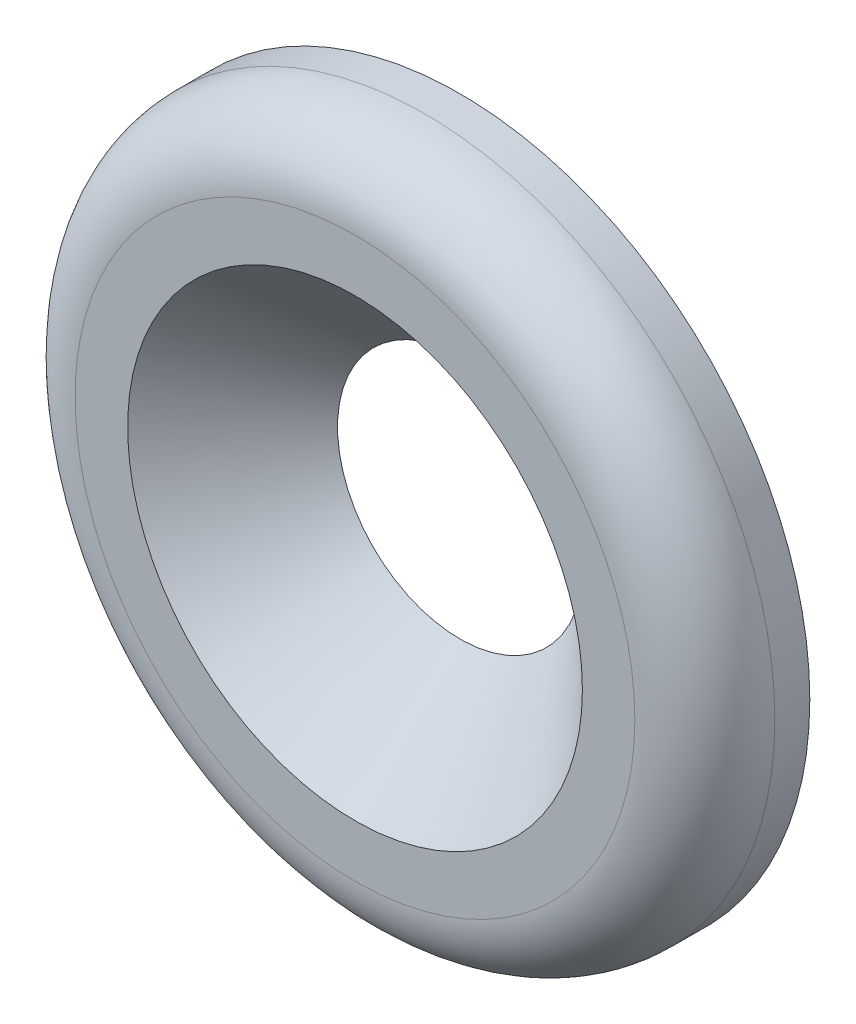
ISO-10303-21;
HEADER;
FILE_DESCRIPTION(('STEP AP214'),'2;1');
FILE_NAME('part.step','',(''),(''),'','','');
FILE_SCHEMA(('AUTOMOTIVE_DESIGN { 1 0 10303 214 1 1 1 1 }'));
ENDSEC;
DATA;
#1=APPLICATION_CONTEXT('core data for automotive mechanical design processes');
#2=APPLICATION_PROTOCOL_DEFINITION('international standard','automotive_design',2000,#1);
#3=PRODUCT_CONTEXT('',#1,'mechanical');
#4=PRODUCT('Part','Part','',(#3));
#5=PRODUCT_RELATED_PRODUCT_CATEGORY('part','',(#4));
#6=PRODUCT_DEFINITION_FORMATION('','',#4);
#7=PRODUCT_DEFINITION_CONTEXT('part definition',#1,'design');
#8=PRODUCT_DEFINITION('design','',#6,#7);
#9=PRODUCT_DEFINITION_SHAPE('','',#8);
#10=(LENGTH_UNIT() NAMED_UNIT(*) SI_UNIT(.MILLI.,.METRE.));
#11=(NAMED_UNIT(*) PLANE_ANGLE_UNIT() SI_UNIT($,.RADIAN.));
#12=(NAMED_UNIT(*) SI_UNIT($,.STERADIAN.) SOLID_ANGLE_UNIT());
#13=UNCERTAINTY_MEASURE_WITH_UNIT(LENGTH_MEASURE(1.E-05),#10,'distance_accuracy_value','');
#14=(GEOMETRIC_REPRESENTATION_CONTEXT(3) GLOBAL_UNCERTAINTY_ASSIGNED_CONTEXT((#13)) GLOBAL_UNIT_ASSIGNED_CONTEXT((#10,
#11,#12)) REPRESENTATION_CONTEXT('',''));
#15=CARTESIAN_POINT('',(0.,0.,0.));
#16=DIRECTION('',(0.,0.,1.));
#17=DIRECTION('',(1.,0.,0.));
#18=AXIS2_PLACEMENT_3D('',#15,#16,#17);
#19=CARTESIAN_POINT('',(0.,0.,1.5));
#20=DIRECTION('',(0.,0.,1.));
#21=DIRECTION('',(1.,0.,0.));
#22=AXIS2_PLACEMENT_3D('',#19,#20,#21);
#23=PLANE('',#22);
#24=CARTESIAN_POINT('',(0.,0.,1.5));
#25=DIRECTION('',(0.,0.,1.));
#26=DIRECTION('',(1.,0.,0.));
#27=AXIS2_PLACEMENT_3D('',#24,#25,#26);
#28=CIRCLE('',#27,4.);
#29=CARTESIAN_POINT('',(4.,0.,1.5));
#30=VERTEX_POINT('',#29);
#31=EDGE_CURVE('E40',#30,#30,#28,.T.);
#32=ORIENTED_EDGE('',*,*,#31,.T.);
#33=EDGE_LOOP('',(#32));
#34=FACE_BOUND('',#33,.T.);
#35=CARTESIAN_POINT('',(0.,0.,1.5));
#36=DIRECTION('',(0.,0.,1.));
#37=DIRECTION('',(1.,0.,0.));
#38=AXIS2_PLACEMENT_3D('',#35,#36,#37);
#39=CIRCLE('',#38,3.25000000000001);
#40=CARTESIAN_POINT('',(3.25000000000001,0.,1.5));
#41=VERTEX_POINT('',#40);
#42=EDGE_CURVE('E44',#41,#41,#39,.F.);
#43=ORIENTED_EDGE('',*,*,#42,.T.);
#44=EDGE_LOOP('',(#43));
#45=FACE_BOUND('',#44,.T.);
#46=ADVANCED_FACE('F33',(#34,#45),#23,.T.);
#47=CARTESIAN_POINT('',(0.,0.,0.));
#48=DIRECTION('',(0.,0.,1.));
#49=DIRECTION('',(1.,0.,0.));
#50=AXIS2_PLACEMENT_3D('',#47,#48,#49);
#51=PLANE('',#50);
#52=CARTESIAN_POINT('',(0.,0.,0.));
#53=DIRECTION('',(0.,0.,1.));
#54=DIRECTION('',(1.,0.,0.));
#55=AXIS2_PLACEMENT_3D('',#52,#53,#54);
#56=CIRCLE('',#55,5.);
#57=CARTESIAN_POINT('',(5.,0.,0.));
#58=VERTEX_POINT('',#57);
#59=EDGE_CURVE('E48',#58,#58,#56,.T.);
#60=ORIENTED_EDGE('',*,*,#59,.F.);
#61=EDGE_LOOP('',(#60));
#62=FACE_BOUND('',#61,.T.);
#63=CARTESIAN_POINT('',(0.,0.,0.));
#64=DIRECTION('',(0.,0.,1.));
#65=DIRECTION('',(1.,0.,0.));
#66=AXIS2_PLACEMENT_3D('',#63,#64,#65);
#67=CIRCLE('',#66,1.75);
#68=CARTESIAN_POINT('',(1.75,0.,0.));
#69=VERTEX_POINT('',#68);
#70=EDGE_CURVE('E53',#69,#69,#67,.T.);
#71=ORIENTED_EDGE('',*,*,#70,.T.);
#72=EDGE_LOOP('',(#71));
#73=FACE_BOUND('',#72,.T.);
#74=ADVANCED_FACE('F57',(#62,#73),#51,.F.);
#75=CARTESIAN_POINT('',(0.,0.,1.5));
#76=DIRECTION('',(0.,0.,-1.));
#77=DIRECTION('',(-1.,0.,0.));
#78=AXIS2_PLACEMENT_3D('',#75,#76,#77);
#79=CYLINDRICAL_SURFACE('',#78,5.);
#80=CARTESIAN_POINT('',(0.,0.,0.5));
#81=DIRECTION('',(0.,0.,1.));
#82=DIRECTION('',(1.,0.,0.));
#83=AXIS2_PLACEMENT_3D('',#80,#81,#82);
#84=CIRCLE('',#83,5.);
#85=CARTESIAN_POINT('',(5.,0.,0.5));
#86=VERTEX_POINT('',#85);
#87=EDGE_CURVE('E10',#86,#86,#84,.F.);
#88=ORIENTED_EDGE('',*,*,#87,.T.);
#89=EDGE_LOOP('',(#88));
#90=FACE_BOUND('',#89,.T.);
#91=ORIENTED_EDGE('',*,*,#59,.T.);
#92=EDGE_LOOP('',(#91));
#93=FACE_BOUND('',#92,.T.);
#94=ADVANCED_FACE('F61',(#90,#93),#79,.T.);
#95=CARTESIAN_POINT('',(0.,0.,0.));
#96=DIRECTION('',(0.,0.,1.));
#97=DIRECTION('',(1.,0.,0.));
#98=AXIS2_PLACEMENT_3D('',#95,#96,#97);
#99=CONICAL_SURFACE('',#98,1.75,0.78539816339745);
#100=ORIENTED_EDGE('',*,*,#42,.F.);
#101=EDGE_LOOP('',(#100));
#102=FACE_BOUND('',#101,.T.);
#103=ORIENTED_EDGE('',*,*,#70,.F.);
#104=EDGE_LOOP('',(#103));
#105=FACE_BOUND('',#104,.T.);
#106=ADVANCED_FACE('F59',(#102,#105),#99,.F.);
#107=CARTESIAN_POINT('',(0.,0.,0.5));
#108=DIRECTION('',(0.,0.,1.));
#109=DIRECTION('',(1.,0.,0.));
#110=AXIS2_PLACEMENT_3D('',#107,#108,#109);
#111=TOROIDAL_SURFACE('',#110,4.,1.);
#112=ORIENTED_EDGE('',*,*,#87,.F.);
#113=EDGE_LOOP('',(#112));
#114=FACE_BOUND('',#113,.T.);
#115=ORIENTED_EDGE('',*,*,#31,.F.);
#116=EDGE_LOOP('',(#115));
#117=FACE_BOUND('',#116,.T.);
#118=ADVANCED_FACE('F35',(#114,#117),#111,.T.);
#119=CLOSED_SHELL('',(#46,#74,#94,#106,#118));
#120=MANIFOLD_SOLID_BREP('B2',#119);
#121=ADVANCED_BREP_SHAPE_REPRESENTATION('',(#18,#120),#14);
#122=SHAPE_DEFINITION_REPRESENTATION(#9,#121);
ENDSEC;
END-ISO-10303-21;
